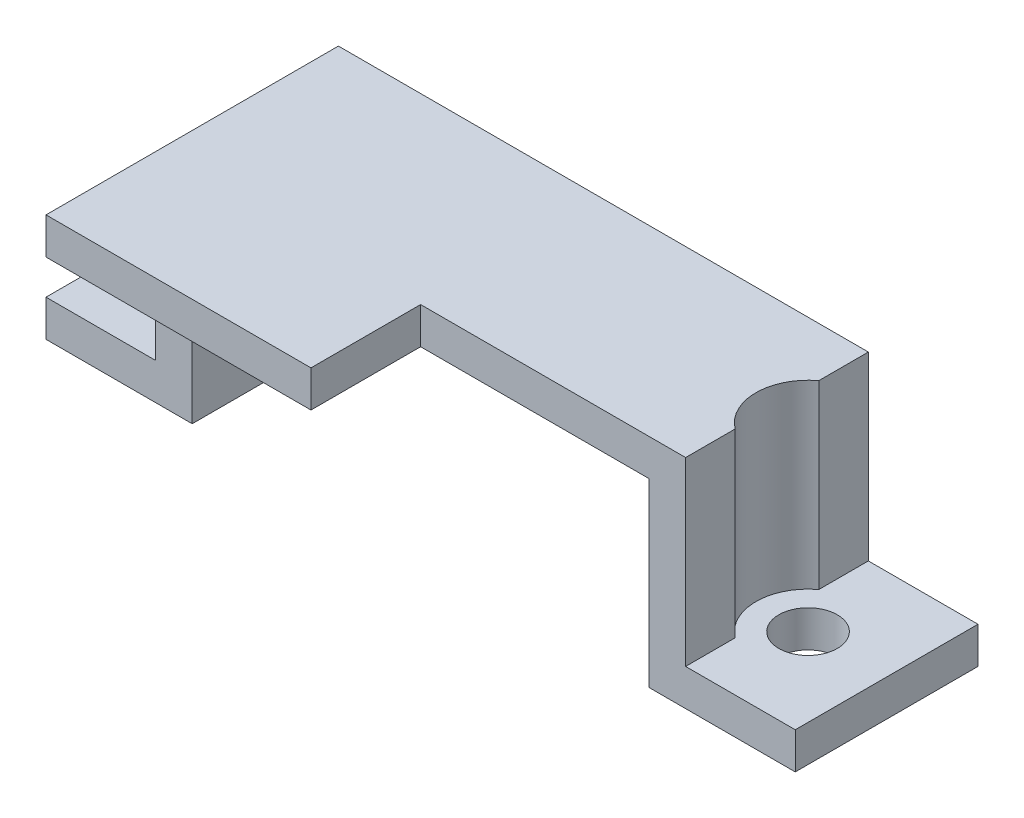
ISO-10303-21;
HEADER;
FILE_DESCRIPTION(('STEP AP214'),'2;1');
FILE_NAME('part.step','',(''),(''),'','','');
FILE_SCHEMA(('AUTOMOTIVE_DESIGN { 1 0 10303 214 1 1 1 1 }'));
ENDSEC;
DATA;
#1=APPLICATION_CONTEXT('core data for automotive mechanical design processes');
#2=APPLICATION_PROTOCOL_DEFINITION('international standard','automotive_design',2000,#1);
#3=PRODUCT_CONTEXT('',#1,'mechanical');
#4=PRODUCT('Part','Part','',(#3));
#5=PRODUCT_RELATED_PRODUCT_CATEGORY('part','',(#4));
#6=PRODUCT_DEFINITION_FORMATION('','',#4);
#7=PRODUCT_DEFINITION_CONTEXT('part definition',#1,'design');
#8=PRODUCT_DEFINITION('design','',#6,#7);
#9=PRODUCT_DEFINITION_SHAPE('','',#8);
#10=(LENGTH_UNIT() NAMED_UNIT(*) SI_UNIT(.MILLI.,.METRE.));
#11=(NAMED_UNIT(*) PLANE_ANGLE_UNIT() SI_UNIT($,.RADIAN.));
#12=(NAMED_UNIT(*) SI_UNIT($,.STERADIAN.) SOLID_ANGLE_UNIT());
#13=UNCERTAINTY_MEASURE_WITH_UNIT(LENGTH_MEASURE(1.E-05),#10,'distance_accuracy_value','');
#14=(GEOMETRIC_REPRESENTATION_CONTEXT(3) GLOBAL_UNCERTAINTY_ASSIGNED_CONTEXT((#13)) GLOBAL_UNIT_ASSIGNED_CONTEXT((#10,
#11,#12)) REPRESENTATION_CONTEXT('',''));
#15=CARTESIAN_POINT('',(0.,0.,0.));
#16=DIRECTION('',(0.,0.,1.));
#17=DIRECTION('',(1.,0.,0.));
#18=AXIS2_PLACEMENT_3D('',#15,#16,#17);
#19=CARTESIAN_POINT('',(15.,12.,10.));
#20=DIRECTION('',(1.,0.,0.));
#21=DIRECTION('',(0.,1.,0.));
#22=AXIS2_PLACEMENT_3D('',#19,#20,#21);
#23=PLANE('',#22);
#24=DIRECTION('',(0.,0.,-1.));
#25=VECTOR('',#24,1.);
#26=CARTESIAN_POINT('',(15.,2.1,10.));
#27=LINE('',#26,#25);
#28=CARTESIAN_POINT('',(15.,2.1,10.));
#29=VERTEX_POINT('',#28);
#30=CARTESIAN_POINT('',(15.,2.1,7.28746584673958));
#31=VERTEX_POINT('',#30);
#32=EDGE_CURVE('E173',#29,#31,#27,.T.);
#33=ORIENTED_EDGE('',*,*,#32,.T.);
#34=DIRECTION('',(0.,-1.,0.));
#35=VECTOR('',#34,1.);
#36=CARTESIAN_POINT('',(15.,20.0610173055266,7.28746584673958));
#37=LINE('',#36,#35);
#38=CARTESIAN_POINT('',(15.,12.,7.28746584673958));
#39=VERTEX_POINT('',#38);
#40=EDGE_CURVE('E157',#31,#39,#37,.F.);
#41=ORIENTED_EDGE('',*,*,#40,.T.);
#42=DIRECTION('',(0.,0.,-1.));
#43=VECTOR('',#42,1.);
#44=CARTESIAN_POINT('',(15.,12.,10.));
#45=LINE('',#44,#43);
#46=CARTESIAN_POINT('',(15.,12.,10.));
#47=VERTEX_POINT('',#46);
#48=EDGE_CURVE('E183',#47,#39,#45,.T.);
#49=ORIENTED_EDGE('',*,*,#48,.F.);
#50=DIRECTION('',(0.,-1.,0.));
#51=VECTOR('',#50,1.);
#52=CARTESIAN_POINT('',(15.,12.,10.));
#53=LINE('',#52,#51);
#54=EDGE_CURVE('E180',#47,#29,#53,.T.);
#55=ORIENTED_EDGE('',*,*,#54,.T.);
#56=EDGE_LOOP('',(#33,#41,#49,#55));
#57=FACE_BOUND('',#56,.T.);
#58=ADVANCED_FACE('F38',(#57),#23,.T.);
#59=CARTESIAN_POINT('',(15.,12.,2.71253415326043));
#60=VERTEX_POINT('',#59);
#61=CARTESIAN_POINT('',(15.,12.,0.));
#62=VERTEX_POINT('',#61);
#63=EDGE_CURVE('E186',#60,#62,#45,.T.);
#64=ORIENTED_EDGE('',*,*,#63,.F.);
#65=DIRECTION('',(0.,-1.,0.));
#66=VECTOR('',#65,1.);
#67=CARTESIAN_POINT('',(15.,20.0610173055266,2.71253415326043));
#68=LINE('',#67,#66);
#69=CARTESIAN_POINT('',(15.,2.1,2.71253415326043));
#70=VERTEX_POINT('',#69);
#71=EDGE_CURVE('E54',#60,#70,#68,.T.);
#72=ORIENTED_EDGE('',*,*,#71,.T.);
#73=CARTESIAN_POINT('',(15.,2.1,0.));
#74=VERTEX_POINT('',#73);
#75=EDGE_CURVE('E176',#70,#74,#27,.T.);
#76=ORIENTED_EDGE('',*,*,#75,.T.);
#77=DIRECTION('',(0.,-1.,0.));
#78=VECTOR('',#77,1.);
#79=CARTESIAN_POINT('',(15.,12.,0.));
#80=LINE('',#79,#78);
#81=EDGE_CURVE('E229',#62,#74,#80,.T.);
#82=ORIENTED_EDGE('',*,*,#81,.F.);
#83=EDGE_LOOP('',(#64,#72,#76,#82));
#84=FACE_BOUND('',#83,.T.);
#85=ADVANCED_FACE('F297',(#84),#23,.T.);
#86=CARTESIAN_POINT('',(0.,0.,10.));
#87=DIRECTION('',(0.,0.,-1.));
#88=DIRECTION('',(-1.,0.,0.));
#89=AXIS2_PLACEMENT_3D('',#86,#87,#88);
#90=PLANE('',#89);
#91=DIRECTION('',(1.,0.,0.));
#92=VECTOR('',#91,1.);
#93=CARTESIAN_POINT('',(-14.,10.,10.));
#94=LINE('',#93,#92);
#95=CARTESIAN_POINT('',(-14.,10.,10.));
#96=VERTEX_POINT('',#95);
#97=CARTESIAN_POINT('',(-12.,10.,10.));
#98=VERTEX_POINT('',#97);
#99=EDGE_CURVE('E276',#96,#98,#94,.T.);
#100=ORIENTED_EDGE('',*,*,#99,.F.);
#101=DIRECTION('',(0.,1.,0.));
#102=VECTOR('',#101,1.);
#103=CARTESIAN_POINT('',(-14.,2.1,10.));
#104=LINE('',#103,#102);
#105=CARTESIAN_POINT('',(-14.,2.1,10.));
#106=VERTEX_POINT('',#105);
#107=EDGE_CURVE('E255',#106,#96,#104,.T.);
#108=ORIENTED_EDGE('',*,*,#107,.F.);
#109=DIRECTION('',(1.,0.,0.));
#110=VECTOR('',#109,1.);
#111=CARTESIAN_POINT('',(-20.,2.1,10.));
#112=LINE('',#111,#110);
#113=CARTESIAN_POINT('',(-20.,2.1,10.));
#114=VERTEX_POINT('',#113);
#115=EDGE_CURVE('E252',#114,#106,#112,.T.);
#116=ORIENTED_EDGE('',*,*,#115,.F.);
#117=DIRECTION('',(0.,1.,0.));
#118=VECTOR('',#117,1.);
#119=CARTESIAN_POINT('',(-20.,0.0999999999999994,10.));
#120=LINE('',#119,#118);
#121=CARTESIAN_POINT('',(-20.,0.0999999999999994,10.));
#122=VERTEX_POINT('',#121);
#123=EDGE_CURVE('E249',#122,#114,#120,.T.);
#124=ORIENTED_EDGE('',*,*,#123,.F.);
#125=DIRECTION('',(1.,0.,0.));
#126=VECTOR('',#125,1.);
#127=CARTESIAN_POINT('',(-20.,0.0999999999999994,10.));
#128=LINE('',#127,#126);
#129=CARTESIAN_POINT('',(-12.,0.0999999999999994,10.));
#130=VERTEX_POINT('',#129);
#131=EDGE_CURVE('E247',#122,#130,#128,.T.);
#132=ORIENTED_EDGE('',*,*,#131,.T.);
#133=DIRECTION('',(0.,1.,0.));
#134=VECTOR('',#133,1.);
#135=CARTESIAN_POINT('',(-12.,2.1,10.));
#136=LINE('',#135,#134);
#137=EDGE_CURVE('E244',#130,#98,#136,.T.);
#138=ORIENTED_EDGE('',*,*,#137,.T.);
#139=EDGE_LOOP('',(#100,#108,#116,#124,#132,#138));
#140=FACE_BOUND('',#139,.T.);
#141=ADVANCED_FACE('F347',(#140),#90,.F.);
#142=CARTESIAN_POINT('',(15.,0.0999999999999994,10.));
#143=DIRECTION('',(0.,1.,0.));
#144=DIRECTION('',(-1.,0.,0.));
#145=AXIS2_PLACEMENT_3D('',#142,#143,#144);
#146=PLANE('',#145);
#147=CARTESIAN_POINT('',(16.7,0.0999999999999994,5.));
#148=DIRECTION('',(0.,1.,0.));
#149=DIRECTION('',(0.,0.,1.));
#150=AXIS2_PLACEMENT_3D('',#147,#148,#149);
#151=CIRCLE('',#150,1.60000000000001);
#152=CARTESIAN_POINT('',(16.7,0.0999999999999994,6.60000000000001));
#153=VERTEX_POINT('',#152);
#154=EDGE_CURVE('E166',#153,#153,#151,.T.);
#155=ORIENTED_EDGE('',*,*,#154,.T.);
#156=EDGE_LOOP('',(#155));
#157=FACE_BOUND('',#156,.T.);
#158=DIRECTION('',(1.,0.,0.));
#159=VECTOR('',#158,1.);
#160=CARTESIAN_POINT('',(15.,0.0999999999999994,0.));
#161=LINE('',#160,#159);
#162=CARTESIAN_POINT('',(13.,0.0999999999999993,0.));
#163=VERTEX_POINT('',#162);
#164=CARTESIAN_POINT('',(21.,0.0999999999999998,0.));
#165=VERTEX_POINT('',#164);
#166=EDGE_CURVE('E238',#163,#165,#161,.T.);
#167=ORIENTED_EDGE('',*,*,#166,.T.);
#168=DIRECTION('',(0.,0.,-1.));
#169=VECTOR('',#168,1.);
#170=CARTESIAN_POINT('',(21.,0.0999999999999998,10.));
#171=LINE('',#170,#169);
#172=CARTESIAN_POINT('',(21.,0.0999999999999998,10.));
#173=VERTEX_POINT('',#172);
#174=EDGE_CURVE('E11',#173,#165,#171,.T.);
#175=ORIENTED_EDGE('',*,*,#174,.F.);
#176=DIRECTION('',(1.,0.,0.));
#177=VECTOR('',#176,1.);
#178=CARTESIAN_POINT('',(15.,0.0999999999999994,10.));
#179=LINE('',#178,#177);
#180=CARTESIAN_POINT('',(13.,0.0999999999999993,10.));
#181=VERTEX_POINT('',#180);
#182=EDGE_CURVE('E210',#181,#173,#179,.T.);
#183=ORIENTED_EDGE('',*,*,#182,.F.);
#184=DIRECTION('',(0.,0.,-1.));
#185=VECTOR('',#184,1.);
#186=CARTESIAN_POINT('',(13.,0.0999999999999993,10.));
#187=LINE('',#186,#185);
#188=EDGE_CURVE('E204',#181,#163,#187,.T.);
#189=ORIENTED_EDGE('',*,*,#188,.T.);
#190=EDGE_LOOP('',(#167,#175,#183,#189));
#191=FACE_BOUND('',#190,.T.);
#192=ADVANCED_FACE('F40',(#157,#191),#146,.F.);
#193=CARTESIAN_POINT('',(21.,2.1,10.));
#194=DIRECTION('',(1.,0.,0.));
#195=DIRECTION('',(0.,0.,-1.));
#196=AXIS2_PLACEMENT_3D('',#193,#194,#195);
#197=PLANE('',#196);
#198=DIRECTION('',(0.,-1.,0.));
#199=VECTOR('',#198,1.);
#200=CARTESIAN_POINT('',(21.,2.1,0.));
#201=LINE('',#200,#199);
#202=CARTESIAN_POINT('',(21.,2.1,0.));
#203=VERTEX_POINT('',#202);
#204=EDGE_CURVE('E235',#203,#165,#201,.T.);
#205=ORIENTED_EDGE('',*,*,#204,.F.);
#206=DIRECTION('',(0.,0.,-1.));
#207=VECTOR('',#206,1.);
#208=CARTESIAN_POINT('',(21.,2.1,10.));
#209=LINE('',#208,#207);
#210=CARTESIAN_POINT('',(21.,2.1,10.));
#211=VERTEX_POINT('',#210);
#212=EDGE_CURVE('E47',#211,#203,#209,.T.);
#213=ORIENTED_EDGE('',*,*,#212,.F.);
#214=DIRECTION('',(0.,-1.,0.));
#215=VECTOR('',#214,1.);
#216=CARTESIAN_POINT('',(21.,2.1,10.));
#217=LINE('',#216,#215);
#218=EDGE_CURVE('E263',#211,#173,#217,.T.);
#219=ORIENTED_EDGE('',*,*,#218,.T.);
#220=ORIENTED_EDGE('',*,*,#174,.T.);
#221=EDGE_LOOP('',(#205,#213,#219,#220));
#222=FACE_BOUND('',#221,.T.);
#223=ADVANCED_FACE('F308',(#222),#197,.T.);
#224=CARTESIAN_POINT('',(15.,2.1,10.));
#225=DIRECTION('',(0.,1.,0.));
#226=DIRECTION('',(-1.,0.,0.));
#227=AXIS2_PLACEMENT_3D('',#224,#225,#226);
#228=PLANE('',#227);
#229=ORIENTED_EDGE('',*,*,#75,.F.);
#230=CARTESIAN_POINT('',(16.7,2.1,5.));
#231=DIRECTION('',(0.,1.,0.));
#232=DIRECTION('',(-1.,0.,0.));
#233=AXIS2_PLACEMENT_3D('',#230,#231,#232);
#234=CIRCLE('',#233,2.85);
#235=EDGE_CURVE('E160',#70,#31,#234,.T.);
#236=ORIENTED_EDGE('',*,*,#235,.T.);
#237=ORIENTED_EDGE('',*,*,#32,.F.);
#238=DIRECTION('',(1.,0.,0.));
#239=VECTOR('',#238,1.);
#240=CARTESIAN_POINT('',(15.,2.1,10.));
#241=LINE('',#240,#239);
#242=EDGE_CURVE('E261',#29,#211,#241,.T.);
#243=ORIENTED_EDGE('',*,*,#242,.T.);
#244=ORIENTED_EDGE('',*,*,#212,.T.);
#245=DIRECTION('',(1.,0.,0.));
#246=VECTOR('',#245,1.);
#247=CARTESIAN_POINT('',(15.,2.1,0.));
#248=LINE('',#247,#246);
#249=EDGE_CURVE('E232',#74,#203,#248,.T.);
#250=ORIENTED_EDGE('',*,*,#249,.F.);
#251=EDGE_LOOP('',(#229,#236,#237,#243,#244,#250));
#252=FACE_BOUND('',#251,.T.);
#253=CARTESIAN_POINT('',(16.7,2.1,5.));
#254=DIRECTION('',(0.,1.,0.));
#255=DIRECTION('',(-1.,0.,0.));
#256=AXIS2_PLACEMENT_3D('',#253,#254,#255);
#257=CIRCLE('',#256,1.60000000000001);
#258=CARTESIAN_POINT('',(15.1,2.1,5.));
#259=VERTEX_POINT('',#258);
#260=EDGE_CURVE('E42',#259,#259,#257,.F.);
#261=ORIENTED_EDGE('',*,*,#260,.T.);
#262=EDGE_LOOP('',(#261));
#263=FACE_BOUND('',#262,.T.);
#264=ADVANCED_FACE('F170',(#252,#263),#228,.T.);
#265=CARTESIAN_POINT('',(-14.,12.,10.));
#266=DIRECTION('',(0.,1.,0.));
#267=DIRECTION('',(0.,0.,1.));
#268=AXIS2_PLACEMENT_3D('',#265,#266,#267);
#269=PLANE('',#268);
#270=ORIENTED_EDGE('',*,*,#48,.T.);
#271=CARTESIAN_POINT('',(16.7,12.,5.));
#272=DIRECTION('',(0.,1.,0.));
#273=DIRECTION('',(0.,0.,1.));
#274=AXIS2_PLACEMENT_3D('',#271,#272,#273);
#275=CIRCLE('',#274,2.85);
#276=EDGE_CURVE('E161',#60,#39,#275,.T.);
#277=ORIENTED_EDGE('',*,*,#276,.F.);
#278=ORIENTED_EDGE('',*,*,#63,.T.);
#279=DIRECTION('',(1.,0.,0.));
#280=VECTOR('',#279,1.);
#281=CARTESIAN_POINT('',(-14.,12.,0.));
#282=LINE('',#281,#280);
#283=CARTESIAN_POINT('',(-14.,12.,0.));
#284=VERTEX_POINT('',#283);
#285=EDGE_CURVE('E226',#284,#62,#282,.T.);
#286=ORIENTED_EDGE('',*,*,#285,.F.);
#287=DIRECTION('',(0.,0.,-1.));
#288=VECTOR('',#287,1.);
#289=CARTESIAN_POINT('',(-14.,12.,10.));
#290=LINE('',#289,#288);
#291=CARTESIAN_POINT('',(-14.,12.,16.));
#292=VERTEX_POINT('',#291);
#293=EDGE_CURVE('E187',#292,#284,#290,.T.);
#294=ORIENTED_EDGE('',*,*,#293,.F.);
#295=DIRECTION('',(1.,0.,0.));
#296=VECTOR('',#295,1.);
#297=CARTESIAN_POINT('',(-14.,12.,16.));
#298=LINE('',#297,#296);
#299=CARTESIAN_POINT('',(0.5,12.,16.));
#300=VERTEX_POINT('',#299);
#301=EDGE_CURVE('E280',#292,#300,#298,.T.);
#302=ORIENTED_EDGE('',*,*,#301,.T.);
#303=DIRECTION('',(0.,0.,-1.));
#304=VECTOR('',#303,1.);
#305=CARTESIAN_POINT('',(0.5,12.,16.));
#306=LINE('',#305,#304);
#307=CARTESIAN_POINT('',(0.5,12.,10.));
#308=VERTEX_POINT('',#307);
#309=EDGE_CURVE('E268',#300,#308,#306,.T.);
#310=ORIENTED_EDGE('',*,*,#309,.T.);
#311=DIRECTION('',(1.,0.,0.));
#312=VECTOR('',#311,1.);
#313=CARTESIAN_POINT('',(-14.,12.,10.));
#314=LINE('',#313,#312);
#315=EDGE_CURVE('E258',#308,#47,#314,.T.);
#316=ORIENTED_EDGE('',*,*,#315,.T.);
#317=EDGE_LOOP('',(#270,#277,#278,#286,#294,#302,#310,#316));
#318=FACE_BOUND('',#317,.T.);
#319=ADVANCED_FACE('F301',(#318),#269,.T.);
#320=CARTESIAN_POINT('',(-14.,2.1,10.));
#321=DIRECTION('',(-1.,0.,0.));
#322=DIRECTION('',(0.,0.,1.));
#323=AXIS2_PLACEMENT_3D('',#320,#321,#322);
#324=PLANE('',#323);
#325=DIRECTION('',(0.,1.,0.));
#326=VECTOR('',#325,1.);
#327=CARTESIAN_POINT('',(-14.,2.1,0.));
#328=LINE('',#327,#326);
#329=CARTESIAN_POINT('',(-14.,2.1,0.));
#330=VERTEX_POINT('',#329);
#331=EDGE_CURVE('E223',#330,#284,#328,.T.);
#332=ORIENTED_EDGE('',*,*,#331,.F.);
#333=DIRECTION('',(0.,0.,-1.));
#334=VECTOR('',#333,1.);
#335=CARTESIAN_POINT('',(-14.,2.1,10.));
#336=LINE('',#335,#334);
#337=EDGE_CURVE('E189',#106,#330,#336,.T.);
#338=ORIENTED_EDGE('',*,*,#337,.F.);
#339=ORIENTED_EDGE('',*,*,#107,.T.);
#340=DIRECTION('',(0.,0.,-1.));
#341=VECTOR('',#340,1.);
#342=CARTESIAN_POINT('',(-14.,10.,16.));
#343=LINE('',#342,#341);
#344=CARTESIAN_POINT('',(-14.,10.,16.));
#345=VERTEX_POINT('',#344);
#346=EDGE_CURVE('E270',#345,#96,#343,.T.);
#347=ORIENTED_EDGE('',*,*,#346,.F.);
#348=DIRECTION('',(0.,1.,0.));
#349=VECTOR('',#348,1.);
#350=CARTESIAN_POINT('',(-14.,10.,16.));
#351=LINE('',#350,#349);
#352=EDGE_CURVE('E272',#345,#292,#351,.T.);
#353=ORIENTED_EDGE('',*,*,#352,.T.);
#354=ORIENTED_EDGE('',*,*,#293,.T.);
#355=EDGE_LOOP('',(#332,#338,#339,#347,#353,#354));
#356=FACE_BOUND('',#355,.T.);
#357=ADVANCED_FACE('F316',(#356),#324,.T.);
#358=CARTESIAN_POINT('',(-20.,2.1,10.));
#359=DIRECTION('',(0.,1.,0.));
#360=DIRECTION('',(0.,0.,1.));
#361=AXIS2_PLACEMENT_3D('',#358,#359,#360);
#362=PLANE('',#361);
#363=CARTESIAN_POINT('',(-17.,2.1,5.));
#364=DIRECTION('',(0.,1.,0.));
#365=DIRECTION('',(0.,0.,1.));
#366=AXIS2_PLACEMENT_3D('',#363,#364,#365);
#367=CIRCLE('',#366,1.6);
#368=CARTESIAN_POINT('',(-17.,2.1,6.6));
#369=VERTEX_POINT('',#368);
#370=EDGE_CURVE('E286',#369,#369,#367,.F.);
#371=ORIENTED_EDGE('',*,*,#370,.T.);
#372=EDGE_LOOP('',(#371));
#373=FACE_BOUND('',#372,.T.);
#374=DIRECTION('',(1.,0.,0.));
#375=VECTOR('',#374,1.);
#376=CARTESIAN_POINT('',(-20.,2.1,0.));
#377=LINE('',#376,#375);
#378=CARTESIAN_POINT('',(-20.,2.1,0.));
#379=VERTEX_POINT('',#378);
#380=EDGE_CURVE('E220',#379,#330,#377,.T.);
#381=ORIENTED_EDGE('',*,*,#380,.F.);
#382=DIRECTION('',(0.,0.,-1.));
#383=VECTOR('',#382,1.);
#384=CARTESIAN_POINT('',(-20.,2.1,10.));
#385=LINE('',#384,#383);
#386=EDGE_CURVE('E191',#114,#379,#385,.T.);
#387=ORIENTED_EDGE('',*,*,#386,.F.);
#388=ORIENTED_EDGE('',*,*,#115,.T.);
#389=ORIENTED_EDGE('',*,*,#337,.T.);
#390=EDGE_LOOP('',(#381,#387,#388,#389));
#391=FACE_BOUND('',#390,.T.);
#392=ADVANCED_FACE('F356',(#373,#391),#362,.T.);
#393=CARTESIAN_POINT('',(-20.,0.0999999999999994,10.));
#394=DIRECTION('',(-1.,0.,0.));
#395=DIRECTION('',(0.,0.,1.));
#396=AXIS2_PLACEMENT_3D('',#393,#394,#395);
#397=PLANE('',#396);
#398=DIRECTION('',(0.,1.,0.));
#399=VECTOR('',#398,1.);
#400=CARTESIAN_POINT('',(-20.,0.0999999999999994,0.));
#401=LINE('',#400,#399);
#402=CARTESIAN_POINT('',(-20.,0.0999999999999994,0.));
#403=VERTEX_POINT('',#402);
#404=EDGE_CURVE('E217',#403,#379,#401,.T.);
#405=ORIENTED_EDGE('',*,*,#404,.F.);
#406=DIRECTION('',(0.,0.,-1.));
#407=VECTOR('',#406,1.);
#408=CARTESIAN_POINT('',(-20.,0.0999999999999994,10.));
#409=LINE('',#408,#407);
#410=EDGE_CURVE('E193',#122,#403,#409,.T.);
#411=ORIENTED_EDGE('',*,*,#410,.F.);
#412=ORIENTED_EDGE('',*,*,#123,.T.);
#413=ORIENTED_EDGE('',*,*,#386,.T.);
#414=EDGE_LOOP('',(#405,#411,#412,#413));
#415=FACE_BOUND('',#414,.T.);
#416=ADVANCED_FACE('F354',(#415),#397,.T.);
#417=CARTESIAN_POINT('',(-20.,0.0999999999999994,10.));
#418=DIRECTION('',(0.,1.,0.));
#419=DIRECTION('',(0.,0.,1.));
#420=AXIS2_PLACEMENT_3D('',#417,#418,#419);
#421=PLANE('',#420);
#422=CARTESIAN_POINT('',(-17.,0.0999999999999994,5.));
#423=DIRECTION('',(0.,1.,0.));
#424=DIRECTION('',(0.,0.,1.));
#425=AXIS2_PLACEMENT_3D('',#422,#423,#424);
#426=CIRCLE('',#425,1.6);
#427=CARTESIAN_POINT('',(-17.,0.0999999999999994,6.6));
#428=VERTEX_POINT('',#427);
#429=EDGE_CURVE('E289',#428,#428,#426,.T.);
#430=ORIENTED_EDGE('',*,*,#429,.T.);
#431=EDGE_LOOP('',(#430));
#432=FACE_BOUND('',#431,.T.);
#433=DIRECTION('',(1.,0.,0.));
#434=VECTOR('',#433,1.);
#435=CARTESIAN_POINT('',(-20.,0.0999999999999994,0.));
#436=LINE('',#435,#434);
#437=CARTESIAN_POINT('',(-12.,0.0999999999999994,0.));
#438=VERTEX_POINT('',#437);
#439=EDGE_CURVE('E215',#403,#438,#436,.T.);
#440=ORIENTED_EDGE('',*,*,#439,.T.);
#441=DIRECTION('',(0.,0.,-1.));
#442=VECTOR('',#441,1.);
#443=CARTESIAN_POINT('',(-12.,0.0999999999999994,10.));
#444=LINE('',#443,#442);
#445=EDGE_CURVE('E195',#130,#438,#444,.T.);
#446=ORIENTED_EDGE('',*,*,#445,.F.);
#447=ORIENTED_EDGE('',*,*,#131,.F.);
#448=ORIENTED_EDGE('',*,*,#410,.T.);
#449=EDGE_LOOP('',(#440,#446,#447,#448));
#450=FACE_BOUND('',#449,.T.);
#451=ADVANCED_FACE('F352',(#432,#450),#421,.F.);
#452=CARTESIAN_POINT('',(-12.,2.1,10.));
#453=DIRECTION('',(-1.,0.,0.));
#454=DIRECTION('',(0.,0.,1.));
#455=AXIS2_PLACEMENT_3D('',#452,#453,#454);
#456=PLANE('',#455);
#457=DIRECTION('',(0.,1.,0.));
#458=VECTOR('',#457,1.);
#459=CARTESIAN_POINT('',(-12.,2.1,0.));
#460=LINE('',#459,#458);
#461=CARTESIAN_POINT('',(-12.,10.,0.));
#462=VERTEX_POINT('',#461);
#463=EDGE_CURVE('E213',#438,#462,#460,.T.);
#464=ORIENTED_EDGE('',*,*,#463,.T.);
#465=DIRECTION('',(0.,0.,-1.));
#466=VECTOR('',#465,1.);
#467=CARTESIAN_POINT('',(-12.,10.,10.));
#468=LINE('',#467,#466);
#469=EDGE_CURVE('E198',#98,#462,#468,.T.);
#470=ORIENTED_EDGE('',*,*,#469,.F.);
#471=ORIENTED_EDGE('',*,*,#137,.F.);
#472=ORIENTED_EDGE('',*,*,#445,.T.);
#473=EDGE_LOOP('',(#464,#470,#471,#472));
#474=FACE_BOUND('',#473,.T.);
#475=ADVANCED_FACE('F342',(#474),#456,.F.);
#476=CARTESIAN_POINT('',(-14.,10.,10.));
#477=DIRECTION('',(0.,1.,0.));
#478=DIRECTION('',(0.,0.,1.));
#479=AXIS2_PLACEMENT_3D('',#476,#477,#478);
#480=PLANE('',#479);
#481=DIRECTION('',(1.,0.,0.));
#482=VECTOR('',#481,1.);
#483=CARTESIAN_POINT('',(-14.,10.,0.));
#484=LINE('',#483,#482);
#485=CARTESIAN_POINT('',(13.,10.,0.));
#486=VERTEX_POINT('',#485);
#487=EDGE_CURVE('E211',#462,#486,#484,.T.);
#488=ORIENTED_EDGE('',*,*,#487,.T.);
#489=DIRECTION('',(0.,0.,-1.));
#490=VECTOR('',#489,1.);
#491=CARTESIAN_POINT('',(13.,10.,10.));
#492=LINE('',#491,#490);
#493=CARTESIAN_POINT('',(13.,10.,10.));
#494=VERTEX_POINT('',#493);
#495=EDGE_CURVE('E201',#494,#486,#492,.T.);
#496=ORIENTED_EDGE('',*,*,#495,.F.);
#497=DIRECTION('',(1.,0.,0.));
#498=VECTOR('',#497,1.);
#499=CARTESIAN_POINT('',(-14.,10.,10.));
#500=LINE('',#499,#498);
#501=CARTESIAN_POINT('',(0.5,10.,10.));
#502=VERTEX_POINT('',#501);
#503=EDGE_CURVE('E242',#502,#494,#500,.T.);
#504=ORIENTED_EDGE('',*,*,#503,.F.);
#505=DIRECTION('',(0.,0.,-1.));
#506=VECTOR('',#505,1.);
#507=CARTESIAN_POINT('',(0.5,10.,16.));
#508=LINE('',#507,#506);
#509=CARTESIAN_POINT('',(0.5,10.,16.));
#510=VERTEX_POINT('',#509);
#511=EDGE_CURVE('E62',#510,#502,#508,.T.);
#512=ORIENTED_EDGE('',*,*,#511,.F.);
#513=DIRECTION('',(1.,0.,0.));
#514=VECTOR('',#513,1.);
#515=CARTESIAN_POINT('',(-14.,10.,16.));
#516=LINE('',#515,#514);
#517=EDGE_CURVE('E275',#345,#510,#516,.T.);
#518=ORIENTED_EDGE('',*,*,#517,.F.);
#519=ORIENTED_EDGE('',*,*,#346,.T.);
#520=ORIENTED_EDGE('',*,*,#99,.T.);
#521=ORIENTED_EDGE('',*,*,#469,.T.);
#522=EDGE_LOOP('',(#488,#496,#504,#512,#518,#519,#520,#521));
#523=FACE_BOUND('',#522,.T.);
#524=ADVANCED_FACE('F328',(#523),#480,.F.);
#525=CARTESIAN_POINT('',(13.,12.,10.));
#526=DIRECTION('',(1.,0.,0.));
#527=DIRECTION('',(0.,1.,0.));
#528=AXIS2_PLACEMENT_3D('',#525,#526,#527);
#529=PLANE('',#528);
#530=DIRECTION('',(0.,-1.,0.));
#531=VECTOR('',#530,1.);
#532=CARTESIAN_POINT('',(13.,12.,0.));
#533=LINE('',#532,#531);
#534=EDGE_CURVE('E208',#486,#163,#533,.T.);
#535=ORIENTED_EDGE('',*,*,#534,.T.);
#536=ORIENTED_EDGE('',*,*,#188,.F.);
#537=DIRECTION('',(0.,-1.,0.));
#538=VECTOR('',#537,1.);
#539=CARTESIAN_POINT('',(13.,12.,10.));
#540=LINE('',#539,#538);
#541=EDGE_CURVE('E207',#494,#181,#540,.T.);
#542=ORIENTED_EDGE('',*,*,#541,.F.);
#543=ORIENTED_EDGE('',*,*,#495,.T.);
#544=EDGE_LOOP('',(#535,#536,#542,#543));
#545=FACE_BOUND('',#544,.T.);
#546=ADVANCED_FACE('F334',(#545),#529,.F.);
#547=ORIENTED_EDGE('',*,*,#315,.F.);
#548=DIRECTION('',(0.,-1.,0.));
#549=VECTOR('',#548,1.);
#550=CARTESIAN_POINT('',(0.5,12.,10.));
#551=LINE('',#550,#549);
#552=EDGE_CURVE('E273',#308,#502,#551,.T.);
#553=ORIENTED_EDGE('',*,*,#552,.T.);
#554=ORIENTED_EDGE('',*,*,#503,.T.);
#555=ORIENTED_EDGE('',*,*,#541,.T.);
#556=ORIENTED_EDGE('',*,*,#182,.T.);
#557=ORIENTED_EDGE('',*,*,#218,.F.);
#558=ORIENTED_EDGE('',*,*,#242,.F.);
#559=ORIENTED_EDGE('',*,*,#54,.F.);
#560=EDGE_LOOP('',(#547,#553,#554,#555,#556,#557,#558,#559));
#561=FACE_BOUND('',#560,.T.);
#562=ADVANCED_FACE('F304',(#561),#90,.F.);
#563=CARTESIAN_POINT('',(0.,0.,0.));
#564=DIRECTION('',(0.,0.,-1.));
#565=DIRECTION('',(-1.,0.,0.));
#566=AXIS2_PLACEMENT_3D('',#563,#564,#565);
#567=PLANE('',#566);
#568=ORIENTED_EDGE('',*,*,#166,.F.);
#569=ORIENTED_EDGE('',*,*,#534,.F.);
#570=ORIENTED_EDGE('',*,*,#487,.F.);
#571=ORIENTED_EDGE('',*,*,#463,.F.);
#572=ORIENTED_EDGE('',*,*,#439,.F.);
#573=ORIENTED_EDGE('',*,*,#404,.T.);
#574=ORIENTED_EDGE('',*,*,#380,.T.);
#575=ORIENTED_EDGE('',*,*,#331,.T.);
#576=ORIENTED_EDGE('',*,*,#285,.T.);
#577=ORIENTED_EDGE('',*,*,#81,.T.);
#578=ORIENTED_EDGE('',*,*,#249,.T.);
#579=ORIENTED_EDGE('',*,*,#204,.T.);
#580=EDGE_LOOP('',(#568,#569,#570,#571,#572,#573,#574,#575,#576,#577,#578,#579));
#581=FACE_BOUND('',#580,.T.);
#582=ADVANCED_FACE('F312',(#581),#567,.T.);
#583=CARTESIAN_POINT('',(0.5,12.,16.));
#584=DIRECTION('',(1.,0.,0.));
#585=DIRECTION('',(0.,0.,-1.));
#586=AXIS2_PLACEMENT_3D('',#583,#584,#585);
#587=PLANE('',#586);
#588=ORIENTED_EDGE('',*,*,#552,.F.);
#589=ORIENTED_EDGE('',*,*,#309,.F.);
#590=DIRECTION('',(0.,-1.,0.));
#591=VECTOR('',#590,1.);
#592=CARTESIAN_POINT('',(0.5,12.,16.));
#593=LINE('',#592,#591);
#594=EDGE_CURVE('E283',#300,#510,#593,.T.);
#595=ORIENTED_EDGE('',*,*,#594,.T.);
#596=ORIENTED_EDGE('',*,*,#511,.T.);
#597=EDGE_LOOP('',(#588,#589,#595,#596));
#598=FACE_BOUND('',#597,.T.);
#599=ADVANCED_FACE('F324',(#598),#587,.T.);
#600=CARTESIAN_POINT('',(0.,0.,16.));
#601=DIRECTION('',(0.,0.,-1.));
#602=DIRECTION('',(-1.,0.,0.));
#603=AXIS2_PLACEMENT_3D('',#600,#601,#602);
#604=PLANE('',#603);
#605=ORIENTED_EDGE('',*,*,#517,.T.);
#606=ORIENTED_EDGE('',*,*,#594,.F.);
#607=ORIENTED_EDGE('',*,*,#301,.F.);
#608=ORIENTED_EDGE('',*,*,#352,.F.);
#609=EDGE_LOOP('',(#605,#606,#607,#608));
#610=FACE_BOUND('',#609,.T.);
#611=ADVANCED_FACE('F322',(#610),#604,.F.);
#612=CARTESIAN_POINT('',(-17.,6.1,5.));
#613=DIRECTION('',(0.,-1.,0.));
#614=DIRECTION('',(0.,0.,-1.));
#615=AXIS2_PLACEMENT_3D('',#612,#613,#614);
#616=CYLINDRICAL_SURFACE('',#615,1.6);
#617=ORIENTED_EDGE('',*,*,#370,.F.);
#618=EDGE_LOOP('',(#617));
#619=FACE_BOUND('',#618,.T.);
#620=ORIENTED_EDGE('',*,*,#429,.F.);
#621=EDGE_LOOP('',(#620));
#622=FACE_BOUND('',#621,.T.);
#623=ADVANCED_FACE('F387',(#619,#622),#616,.F.);
#624=CARTESIAN_POINT('',(16.7,6.1,5.));
#625=DIRECTION('',(0.,-1.,0.));
#626=DIRECTION('',(0.,0.,-1.));
#627=AXIS2_PLACEMENT_3D('',#624,#625,#626);
#628=CYLINDRICAL_SURFACE('',#627,1.60000000000001);
#629=ORIENTED_EDGE('',*,*,#260,.F.);
#630=EDGE_LOOP('',(#629));
#631=FACE_BOUND('',#630,.T.);
#632=ORIENTED_EDGE('',*,*,#154,.F.);
#633=EDGE_LOOP('',(#632));
#634=FACE_BOUND('',#633,.T.);
#635=ADVANCED_FACE('F385',(#631,#634),#628,.F.);
#636=CARTESIAN_POINT('',(16.7,20.0610173055266,5.));
#637=DIRECTION('',(0.,-1.,0.));
#638=DIRECTION('',(1.,0.,0.));
#639=AXIS2_PLACEMENT_3D('',#636,#637,#638);
#640=CYLINDRICAL_SURFACE('',#639,2.85);
#641=ORIENTED_EDGE('',*,*,#235,.F.);
#642=ORIENTED_EDGE('',*,*,#71,.F.);
#643=ORIENTED_EDGE('',*,*,#276,.T.);
#644=ORIENTED_EDGE('',*,*,#40,.F.);
#645=EDGE_LOOP('',(#641,#642,#643,#644));
#646=FACE_BOUND('',#645,.T.);
#647=ADVANCED_FACE('F159',(#646),#640,.F.);
#648=CLOSED_SHELL('',(#58,#85,#141,#192,#223,#264,#319,#357,#392,#416,#451,#475,#524,#546,#562,
#582,#599,#611,#623,#635,#647));
#649=MANIFOLD_SOLID_BREP('B2',#648);
#650=ADVANCED_BREP_SHAPE_REPRESENTATION('',(#18,#649),#14);
#651=SHAPE_DEFINITION_REPRESENTATION(#9,#650);
ENDSEC;
END-ISO-10303-21;
